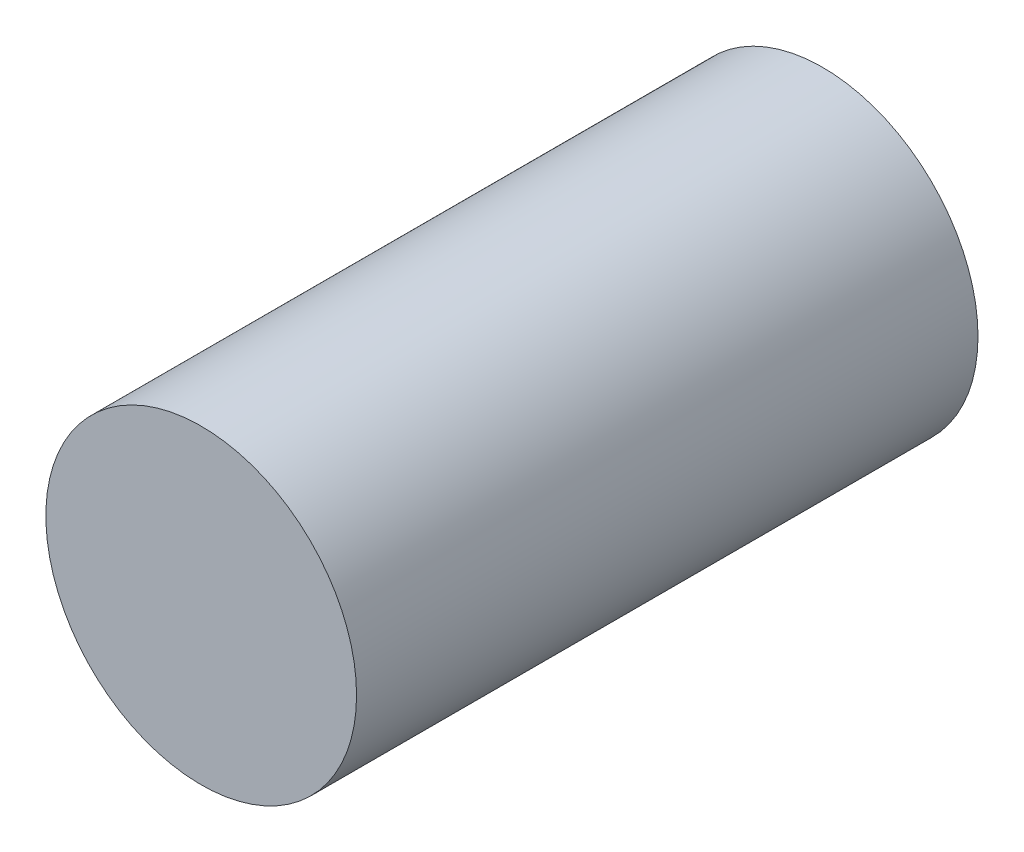
ISO-10303-21;
HEADER;
FILE_DESCRIPTION(('STEP AP214'),'2;1');
FILE_NAME('part.step','',(''),(''),'','','');
FILE_SCHEMA(('AUTOMOTIVE_DESIGN { 1 0 10303 214 1 1 1 1 }'));
ENDSEC;
DATA;
#1=APPLICATION_CONTEXT('core data for automotive mechanical design processes');
#2=APPLICATION_PROTOCOL_DEFINITION('international standard','automotive_design',2000,#1);
#3=PRODUCT_CONTEXT('',#1,'mechanical');
#4=PRODUCT('Part','Part','',(#3));
#5=PRODUCT_RELATED_PRODUCT_CATEGORY('part','',(#4));
#6=PRODUCT_DEFINITION_FORMATION('','',#4);
#7=PRODUCT_DEFINITION_CONTEXT('part definition',#1,'design');
#8=PRODUCT_DEFINITION('design','',#6,#7);
#9=PRODUCT_DEFINITION_SHAPE('','',#8);
#10=(LENGTH_UNIT() NAMED_UNIT(*) SI_UNIT(.MILLI.,.METRE.));
#11=(NAMED_UNIT(*) PLANE_ANGLE_UNIT() SI_UNIT($,.RADIAN.));
#12=(NAMED_UNIT(*) SI_UNIT($,.STERADIAN.) SOLID_ANGLE_UNIT());
#13=UNCERTAINTY_MEASURE_WITH_UNIT(LENGTH_MEASURE(1.E-05),#10,'distance_accuracy_value','');
#14=(GEOMETRIC_REPRESENTATION_CONTEXT(3) GLOBAL_UNCERTAINTY_ASSIGNED_CONTEXT((#13)) GLOBAL_UNIT_ASSIGNED_CONTEXT((#10,
#11,#12)) REPRESENTATION_CONTEXT('',''));
#15=CARTESIAN_POINT('',(0.,0.,0.));
#16=DIRECTION('',(0.,0.,1.));
#17=DIRECTION('',(1.,0.,0.));
#18=AXIS2_PLACEMENT_3D('',#15,#16,#17);
#19=CARTESIAN_POINT('',(0.,0.,30.));
#20=DIRECTION('',(0.,0.,-1.));
#21=DIRECTION('',(-1.,0.,0.));
#22=AXIS2_PLACEMENT_3D('',#19,#20,#21);
#23=CYLINDRICAL_SURFACE('',#22,7.5);
#24=CARTESIAN_POINT('',(0.,0.,30.));
#25=DIRECTION('',(0.,0.,1.));
#26=DIRECTION('',(1.,0.,0.));
#27=AXIS2_PLACEMENT_3D('',#24,#25,#26);
#28=CIRCLE('',#27,7.5);
#29=CARTESIAN_POINT('',(7.5,0.,30.));
#30=VERTEX_POINT('',#29);
#31=EDGE_CURVE('E10',#30,#30,#28,.T.);
#32=ORIENTED_EDGE('',*,*,#31,.F.);
#33=EDGE_LOOP('',(#32));
#34=FACE_BOUND('',#33,.T.);
#35=CARTESIAN_POINT('',(0.,0.,0.));
#36=DIRECTION('',(0.,0.,1.));
#37=DIRECTION('',(1.,0.,0.));
#38=AXIS2_PLACEMENT_3D('',#35,#36,#37);
#39=CIRCLE('',#38,7.5);
#40=CARTESIAN_POINT('',(7.5,0.,0.));
#41=VERTEX_POINT('',#40);
#42=EDGE_CURVE('E34',#41,#41,#39,.T.);
#43=ORIENTED_EDGE('',*,*,#42,.T.);
#44=EDGE_LOOP('',(#43));
#45=FACE_BOUND('',#44,.T.);
#46=ADVANCED_FACE('F31',(#34,#45),#23,.T.);
#47=CARTESIAN_POINT('',(0.,0.,30.));
#48=DIRECTION('',(0.,0.,1.));
#49=DIRECTION('',(1.,0.,0.));
#50=AXIS2_PLACEMENT_3D('',#47,#48,#49);
#51=PLANE('',#50);
#52=ORIENTED_EDGE('',*,*,#31,.T.);
#53=EDGE_LOOP('',(#52));
#54=FACE_BOUND('',#53,.T.);
#55=ADVANCED_FACE('F46',(#54),#51,.T.);
#56=CARTESIAN_POINT('',(0.,0.,0.));
#57=DIRECTION('',(0.,0.,1.));
#58=DIRECTION('',(1.,0.,0.));
#59=AXIS2_PLACEMENT_3D('',#56,#57,#58);
#60=PLANE('',#59);
#61=ORIENTED_EDGE('',*,*,#42,.F.);
#62=EDGE_LOOP('',(#61));
#63=FACE_BOUND('',#62,.T.);
#64=ADVANCED_FACE('F44',(#63),#60,.F.);
#65=CLOSED_SHELL('',(#46,#55,#64));
#66=MANIFOLD_SOLID_BREP('B2',#65);
#67=ADVANCED_BREP_SHAPE_REPRESENTATION('',(#18,#66),#14);
#68=SHAPE_DEFINITION_REPRESENTATION(#9,#67);
ENDSEC;
END-ISO-10303-21;
